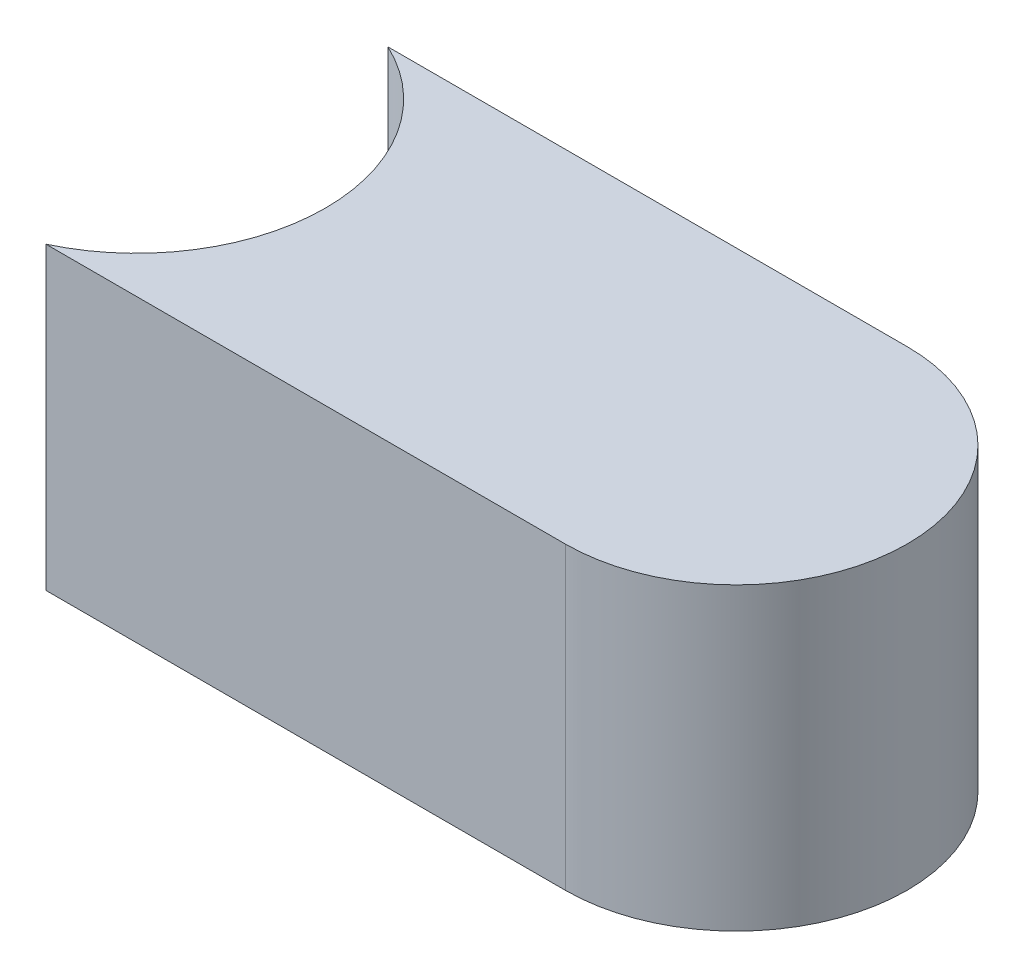
ISO-10303-21;
HEADER;
FILE_DESCRIPTION(('STEP AP214'),'2;1');
FILE_NAME('part.step','',(''),(''),'','','');
FILE_SCHEMA(('AUTOMOTIVE_DESIGN { 1 0 10303 214 1 1 1 1 }'));
ENDSEC;
DATA;
#1=APPLICATION_CONTEXT('core data for automotive mechanical design processes');
#2=APPLICATION_PROTOCOL_DEFINITION('international standard','automotive_design',2000,#1);
#3=PRODUCT_CONTEXT('',#1,'mechanical');
#4=PRODUCT('Part','Part','',(#3));
#5=PRODUCT_RELATED_PRODUCT_CATEGORY('part','',(#4));
#6=PRODUCT_DEFINITION_FORMATION('','',#4);
#7=PRODUCT_DEFINITION_CONTEXT('part definition',#1,'design');
#8=PRODUCT_DEFINITION('design','',#6,#7);
#9=PRODUCT_DEFINITION_SHAPE('','',#8);
#10=(LENGTH_UNIT() NAMED_UNIT(*) SI_UNIT(.MILLI.,.METRE.));
#11=(NAMED_UNIT(*) PLANE_ANGLE_UNIT() SI_UNIT($,.RADIAN.));
#12=(NAMED_UNIT(*) SI_UNIT($,.STERADIAN.) SOLID_ANGLE_UNIT());
#13=UNCERTAINTY_MEASURE_WITH_UNIT(LENGTH_MEASURE(1.E-05),#10,'distance_accuracy_value','');
#14=(GEOMETRIC_REPRESENTATION_CONTEXT(3) GLOBAL_UNCERTAINTY_ASSIGNED_CONTEXT((#13)) GLOBAL_UNIT_ASSIGNED_CONTEXT((#10,
#11,#12)) REPRESENTATION_CONTEXT('',''));
#15=CARTESIAN_POINT('',(0.,0.,0.));
#16=DIRECTION('',(0.,0.,1.));
#17=DIRECTION('',(1.,0.,0.));
#18=AXIS2_PLACEMENT_3D('',#15,#16,#17);
#19=CARTESIAN_POINT('',(3.02613821337703,5.,-2.93322052020636E-06));
#20=DIRECTION('',(0.,-1.,0.));
#21=DIRECTION('',(0.,0.,-1.));
#22=AXIS2_PLACEMENT_3D('',#19,#20,#21);
#23=CYLINDRICAL_SURFACE('',#22,3.14999706677948);
#24=CARTESIAN_POINT('',(3.02613821337703,0.,-2.93322052020636E-06));
#25=DIRECTION('',(0.,1.,0.));
#26=DIRECTION('',(0.,0.,1.));
#27=AXIS2_PLACEMENT_3D('',#24,#25,#26);
#28=CIRCLE('',#27,3.14999706677948);
#29=CARTESIAN_POINT('',(4.36777834398869,0.,2.84999413355896));
#30=VERTEX_POINT('',#29);
#31=CARTESIAN_POINT('',(4.36777834398869,0.,-2.85));
#32=VERTEX_POINT('',#31);
#33=EDGE_CURVE('E110',#30,#32,#28,.T.);
#34=ORIENTED_EDGE('',*,*,#33,.F.);
#35=DIRECTION('',(0.,-1.,0.));
#36=VECTOR('',#35,1.);
#37=CARTESIAN_POINT('',(4.36777834398869,5.,2.84999413355896));
#38=LINE('',#37,#36);
#39=CARTESIAN_POINT('',(4.36777834398869,5.,2.84999413355896));
#40=VERTEX_POINT('',#39);
#41=EDGE_CURVE('E11',#40,#30,#38,.T.);
#42=ORIENTED_EDGE('',*,*,#41,.F.);
#43=CARTESIAN_POINT('',(3.02613821337703,5.,-2.93322052020636E-06));
#44=DIRECTION('',(0.,1.,0.));
#45=DIRECTION('',(0.,0.,1.));
#46=AXIS2_PLACEMENT_3D('',#43,#44,#45);
#47=CIRCLE('',#46,3.14999706677948);
#48=CARTESIAN_POINT('',(4.36777834398869,5.,-2.85));
#49=VERTEX_POINT('',#48);
#50=EDGE_CURVE('E103',#40,#49,#47,.T.);
#51=ORIENTED_EDGE('',*,*,#50,.T.);
#52=DIRECTION('',(0.,-1.,0.));
#53=VECTOR('',#52,1.);
#54=CARTESIAN_POINT('',(4.36777834398869,5.,-2.85));
#55=LINE('',#54,#53);
#56=EDGE_CURVE('E42',#49,#32,#55,.T.);
#57=ORIENTED_EDGE('',*,*,#56,.T.);
#58=EDGE_LOOP('',(#34,#42,#51,#57));
#59=FACE_BOUND('',#58,.T.);
#60=ADVANCED_FACE('F39',(#59),#23,.F.);
#61=CARTESIAN_POINT('',(4.36777834398869,5.,2.84999413355896));
#62=DIRECTION('',(1.69273523872314E-08,0.,-1.));
#63=DIRECTION('',(-1.,0.,-1.69273523872314E-08));
#64=AXIS2_PLACEMENT_3D('',#61,#62,#63);
#65=PLANE('',#64);
#66=DIRECTION('',(1.,0.,1.69273523872314E-08));
#67=VECTOR('',#66,1.);
#68=CARTESIAN_POINT('',(4.36777834398869,0.,2.84999413355896));
#69=LINE('',#68,#67);
#70=CARTESIAN_POINT('',(13.0319227406136,0.,2.84999420495988));
#71=VERTEX_POINT('',#70);
#72=EDGE_CURVE('E73',#30,#71,#69,.T.);
#73=ORIENTED_EDGE('',*,*,#72,.T.);
#74=DIRECTION('',(0.,-1.,0.));
#75=VECTOR('',#74,1.);
#76=CARTESIAN_POINT('',(13.0319227406136,5.,2.84999420495988));
#77=LINE('',#76,#75);
#78=CARTESIAN_POINT('',(13.0319227406136,5.,2.84999420495988));
#79=VERTEX_POINT('',#78);
#80=EDGE_CURVE('E49',#79,#71,#77,.T.);
#81=ORIENTED_EDGE('',*,*,#80,.F.);
#82=DIRECTION('',(1.,0.,1.69273523872314E-08));
#83=VECTOR('',#82,1.);
#84=CARTESIAN_POINT('',(4.36777834398869,5.,2.84999413355896));
#85=LINE('',#84,#83);
#86=EDGE_CURVE('E90',#40,#79,#85,.T.);
#87=ORIENTED_EDGE('',*,*,#86,.F.);
#88=ORIENTED_EDGE('',*,*,#41,.T.);
#89=EDGE_LOOP('',(#73,#81,#87,#88));
#90=FACE_BOUND('',#89,.T.);
#91=ADVANCED_FACE('F126',(#90),#65,.F.);
#92=CARTESIAN_POINT('',(13.026138220013,5.,0.));
#93=DIRECTION('',(0.,-1.,0.));
#94=DIRECTION('',(0.,0.,-1.));
#95=AXIS2_PLACEMENT_3D('',#92,#93,#94);
#96=CYLINDRICAL_SURFACE('',#95,2.85000007526026);
#97=CARTESIAN_POINT('',(13.026138220013,0.,0.));
#98=DIRECTION('',(0.,1.,0.));
#99=DIRECTION('',(0.,0.,1.));
#100=AXIS2_PLACEMENT_3D('',#97,#98,#99);
#101=CIRCLE('',#100,2.85000007526026);
#102=CARTESIAN_POINT('',(13.026138220013,0.,-2.85));
#103=VERTEX_POINT('',#102);
#104=EDGE_CURVE('E98',#71,#103,#101,.T.);
#105=ORIENTED_EDGE('',*,*,#104,.T.);
#106=DIRECTION('',(0.,-1.,0.));
#107=VECTOR('',#106,1.);
#108=CARTESIAN_POINT('',(13.026138220013,5.,-2.85));
#109=LINE('',#108,#107);
#110=CARTESIAN_POINT('',(13.026138220013,5.,-2.85));
#111=VERTEX_POINT('',#110);
#112=EDGE_CURVE('E95',#111,#103,#109,.T.);
#113=ORIENTED_EDGE('',*,*,#112,.F.);
#114=CARTESIAN_POINT('',(13.026138220013,5.,0.));
#115=DIRECTION('',(0.,1.,0.));
#116=DIRECTION('',(0.,0.,1.));
#117=AXIS2_PLACEMENT_3D('',#114,#115,#116);
#118=CIRCLE('',#117,2.85000007526026);
#119=EDGE_CURVE('E85',#79,#111,#118,.T.);
#120=ORIENTED_EDGE('',*,*,#119,.F.);
#121=ORIENTED_EDGE('',*,*,#80,.T.);
#122=EDGE_LOOP('',(#105,#113,#120,#121));
#123=FACE_BOUND('',#122,.T.);
#124=ADVANCED_FACE('F96',(#123),#96,.T.);
#125=CARTESIAN_POINT('',(4.36777834398869,5.,-2.85));
#126=DIRECTION('',(0.,0.,-1.));
#127=DIRECTION('',(-1.,0.,0.));
#128=AXIS2_PLACEMENT_3D('',#125,#126,#127);
#129=PLANE('',#128);
#130=DIRECTION('',(1.,0.,0.));
#131=VECTOR('',#130,1.);
#132=CARTESIAN_POINT('',(4.36777834398869,0.,-2.85));
#133=LINE('',#132,#131);
#134=EDGE_CURVE('E114',#32,#103,#133,.T.);
#135=ORIENTED_EDGE('',*,*,#134,.F.);
#136=ORIENTED_EDGE('',*,*,#56,.F.);
#137=DIRECTION('',(1.,0.,0.));
#138=VECTOR('',#137,1.);
#139=CARTESIAN_POINT('',(4.36777834398869,5.,-2.85));
#140=LINE('',#139,#138);
#141=EDGE_CURVE('E89',#49,#111,#140,.T.);
#142=ORIENTED_EDGE('',*,*,#141,.T.);
#143=ORIENTED_EDGE('',*,*,#112,.T.);
#144=EDGE_LOOP('',(#135,#136,#142,#143));
#145=FACE_BOUND('',#144,.T.);
#146=ADVANCED_FACE('F101',(#145),#129,.T.);
#147=CARTESIAN_POINT('',(3.02613821337703,5.,-2.93322052020636E-06));
#148=DIRECTION('',(0.,1.,0.));
#149=DIRECTION('',(0.,0.,1.));
#150=AXIS2_PLACEMENT_3D('',#147,#148,#149);
#151=PLANE('',#150);
#152=ORIENTED_EDGE('',*,*,#50,.F.);
#153=ORIENTED_EDGE('',*,*,#86,.T.);
#154=ORIENTED_EDGE('',*,*,#119,.T.);
#155=ORIENTED_EDGE('',*,*,#141,.F.);
#156=EDGE_LOOP('',(#152,#153,#154,#155));
#157=FACE_BOUND('',#156,.T.);
#158=ADVANCED_FACE('F88',(#157),#151,.T.);
#159=CARTESIAN_POINT('',(3.02613821337703,0.,-2.93322052020636E-06));
#160=DIRECTION('',(0.,1.,0.));
#161=DIRECTION('',(0.,0.,1.));
#162=AXIS2_PLACEMENT_3D('',#159,#160,#161);
#163=PLANE('',#162);
#164=ORIENTED_EDGE('',*,*,#33,.T.);
#165=ORIENTED_EDGE('',*,*,#134,.T.);
#166=ORIENTED_EDGE('',*,*,#104,.F.);
#167=ORIENTED_EDGE('',*,*,#72,.F.);
#168=EDGE_LOOP('',(#164,#165,#166,#167));
#169=FACE_BOUND('',#168,.T.);
#170=ADVANCED_FACE('F123',(#169),#163,.F.);
#171=CLOSED_SHELL('',(#60,#91,#124,#146,#158,#170));
#172=MANIFOLD_SOLID_BREP('B2',#171);
#173=ADVANCED_BREP_SHAPE_REPRESENTATION('',(#18,#172),#14);
#174=SHAPE_DEFINITION_REPRESENTATION(#9,#173);
ENDSEC;
END-ISO-10303-21;
